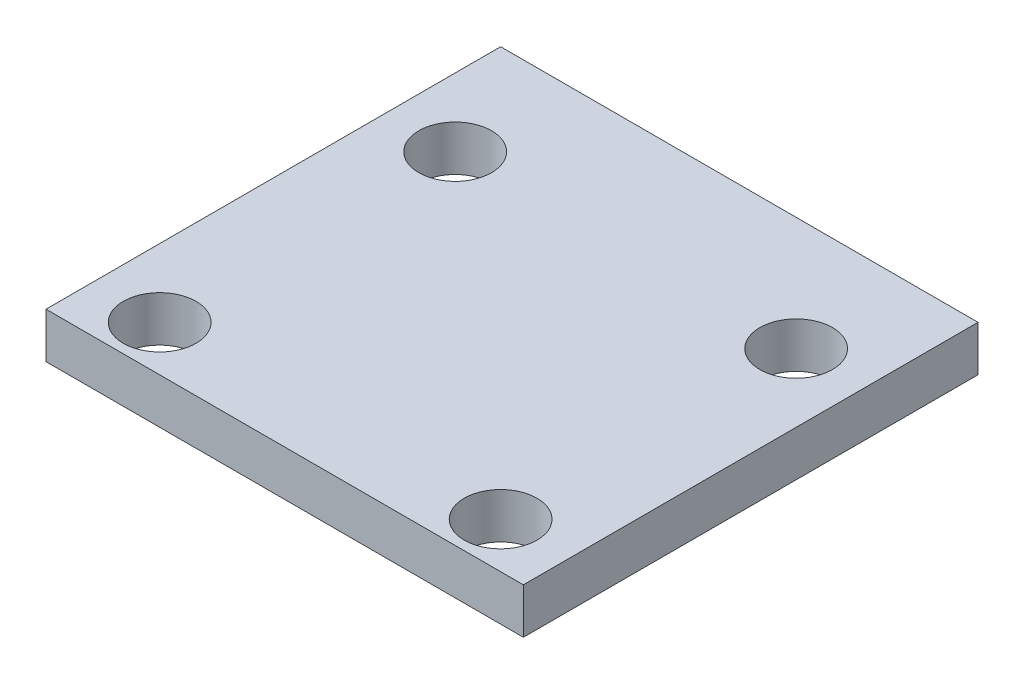
ISO-10303-21;
HEADER;
FILE_DESCRIPTION(('STEP AP214'),'2;1');
FILE_NAME('part.step','',(''),(''),'','','');
FILE_SCHEMA(('AUTOMOTIVE_DESIGN { 1 0 10303 214 1 1 1 1 }'));
ENDSEC;
DATA;
#1=APPLICATION_CONTEXT('core data for automotive mechanical design processes');
#2=APPLICATION_PROTOCOL_DEFINITION('international standard','automotive_design',2000,#1);
#3=PRODUCT_CONTEXT('',#1,'mechanical');
#4=PRODUCT('Part','Part','',(#3));
#5=PRODUCT_RELATED_PRODUCT_CATEGORY('part','',(#4));
#6=PRODUCT_DEFINITION_FORMATION('','',#4);
#7=PRODUCT_DEFINITION_CONTEXT('part definition',#1,'design');
#8=PRODUCT_DEFINITION('design','',#6,#7);
#9=PRODUCT_DEFINITION_SHAPE('','',#8);
#10=(LENGTH_UNIT() NAMED_UNIT(*) SI_UNIT(.MILLI.,.METRE.));
#11=(NAMED_UNIT(*) PLANE_ANGLE_UNIT() SI_UNIT($,.RADIAN.));
#12=(NAMED_UNIT(*) SI_UNIT($,.STERADIAN.) SOLID_ANGLE_UNIT());
#13=UNCERTAINTY_MEASURE_WITH_UNIT(LENGTH_MEASURE(1.E-05),#10,'distance_accuracy_value','');
#14=(GEOMETRIC_REPRESENTATION_CONTEXT(3) GLOBAL_UNCERTAINTY_ASSIGNED_CONTEXT((#13)) GLOBAL_UNIT_ASSIGNED_CONTEXT((#10,
#11,#12)) REPRESENTATION_CONTEXT('',''));
#15=CARTESIAN_POINT('',(0.,0.,0.));
#16=DIRECTION('',(0.,0.,1.));
#17=DIRECTION('',(1.,0.,0.));
#18=AXIS2_PLACEMENT_3D('',#15,#16,#17);
#19=CARTESIAN_POINT('',(10.5,2.,-10.));
#20=DIRECTION('',(-1.,0.,0.));
#21=DIRECTION('',(0.,0.,1.));
#22=AXIS2_PLACEMENT_3D('',#19,#20,#21);
#23=PLANE('',#22);
#24=DIRECTION('',(0.,0.,-1.));
#25=VECTOR('',#24,1.);
#26=CARTESIAN_POINT('',(10.5,0.,-10.));
#27=LINE('',#26,#25);
#28=CARTESIAN_POINT('',(10.5,0.,10.));
#29=VERTEX_POINT('',#28);
#30=CARTESIAN_POINT('',(10.5,0.,-10.));
#31=VERTEX_POINT('',#30);
#32=EDGE_CURVE('E101',#29,#31,#27,.T.);
#33=ORIENTED_EDGE('',*,*,#32,.T.);
#34=DIRECTION('',(0.,-1.,0.));
#35=VECTOR('',#34,1.);
#36=CARTESIAN_POINT('',(10.5,2.,-10.));
#37=LINE('',#36,#35);
#38=CARTESIAN_POINT('',(10.5,2.,-10.));
#39=VERTEX_POINT('',#38);
#40=EDGE_CURVE('E11',#39,#31,#37,.T.);
#41=ORIENTED_EDGE('',*,*,#40,.F.);
#42=DIRECTION('',(0.,0.,-1.));
#43=VECTOR('',#42,1.);
#44=CARTESIAN_POINT('',(10.5,2.,-10.));
#45=LINE('',#44,#43);
#46=CARTESIAN_POINT('',(10.5,2.,10.));
#47=VERTEX_POINT('',#46);
#48=EDGE_CURVE('E90',#47,#39,#45,.T.);
#49=ORIENTED_EDGE('',*,*,#48,.F.);
#50=DIRECTION('',(0.,-1.,0.));
#51=VECTOR('',#50,1.);
#52=CARTESIAN_POINT('',(10.5,2.,10.));
#53=LINE('',#52,#51);
#54=EDGE_CURVE('E100',#47,#29,#53,.T.);
#55=ORIENTED_EDGE('',*,*,#54,.T.);
#56=EDGE_LOOP('',(#33,#41,#49,#55));
#57=FACE_BOUND('',#56,.T.);
#58=ADVANCED_FACE('F36',(#57),#23,.F.);
#59=CARTESIAN_POINT('',(-10.5,2.,-10.));
#60=DIRECTION('',(0.,0.,1.));
#61=DIRECTION('',(1.,0.,0.));
#62=AXIS2_PLACEMENT_3D('',#59,#60,#61);
#63=PLANE('',#62);
#64=DIRECTION('',(-1.,0.,0.));
#65=VECTOR('',#64,1.);
#66=CARTESIAN_POINT('',(-10.5,0.,-10.));
#67=LINE('',#66,#65);
#68=CARTESIAN_POINT('',(-10.5,0.,-10.));
#69=VERTEX_POINT('',#68);
#70=EDGE_CURVE('E91',#31,#69,#67,.T.);
#71=ORIENTED_EDGE('',*,*,#70,.T.);
#72=DIRECTION('',(0.,-1.,0.));
#73=VECTOR('',#72,1.);
#74=CARTESIAN_POINT('',(-10.5,2.,-10.));
#75=LINE('',#74,#73);
#76=CARTESIAN_POINT('',(-10.5,2.,-10.));
#77=VERTEX_POINT('',#76);
#78=EDGE_CURVE('E46',#77,#69,#75,.T.);
#79=ORIENTED_EDGE('',*,*,#78,.F.);
#80=DIRECTION('',(-1.,0.,0.));
#81=VECTOR('',#80,1.);
#82=CARTESIAN_POINT('',(-10.5,2.,-10.));
#83=LINE('',#82,#81);
#84=EDGE_CURVE('E83',#39,#77,#83,.T.);
#85=ORIENTED_EDGE('',*,*,#84,.F.);
#86=ORIENTED_EDGE('',*,*,#40,.T.);
#87=EDGE_LOOP('',(#71,#79,#85,#86));
#88=FACE_BOUND('',#87,.T.);
#89=ADVANCED_FACE('F95',(#88),#63,.F.);
#90=CARTESIAN_POINT('',(-10.5,2.,-10.));
#91=DIRECTION('',(1.,0.,0.));
#92=DIRECTION('',(0.,0.,-1.));
#93=AXIS2_PLACEMENT_3D('',#90,#91,#92);
#94=PLANE('',#93);
#95=DIRECTION('',(0.,0.,1.));
#96=VECTOR('',#95,1.);
#97=CARTESIAN_POINT('',(-10.5,0.,-10.));
#98=LINE('',#97,#96);
#99=CARTESIAN_POINT('',(-10.5,0.,10.));
#100=VERTEX_POINT('',#99);
#101=EDGE_CURVE('E72',#69,#100,#98,.T.);
#102=ORIENTED_EDGE('',*,*,#101,.T.);
#103=DIRECTION('',(0.,-1.,0.));
#104=VECTOR('',#103,1.);
#105=CARTESIAN_POINT('',(-10.5,2.,10.));
#106=LINE('',#105,#104);
#107=CARTESIAN_POINT('',(-10.5,2.,10.));
#108=VERTEX_POINT('',#107);
#109=EDGE_CURVE('E94',#108,#100,#106,.T.);
#110=ORIENTED_EDGE('',*,*,#109,.F.);
#111=DIRECTION('',(0.,0.,1.));
#112=VECTOR('',#111,1.);
#113=CARTESIAN_POINT('',(-10.5,2.,-10.));
#114=LINE('',#113,#112);
#115=EDGE_CURVE('E87',#77,#108,#114,.T.);
#116=ORIENTED_EDGE('',*,*,#115,.F.);
#117=ORIENTED_EDGE('',*,*,#78,.T.);
#118=EDGE_LOOP('',(#102,#110,#116,#117));
#119=FACE_BOUND('',#118,.T.);
#120=ADVANCED_FACE('F92',(#119),#94,.F.);
#121=CARTESIAN_POINT('',(-10.5,2.,10.));
#122=DIRECTION('',(0.,0.,-1.));
#123=DIRECTION('',(-1.,0.,0.));
#124=AXIS2_PLACEMENT_3D('',#121,#122,#123);
#125=PLANE('',#124);
#126=DIRECTION('',(1.,0.,0.));
#127=VECTOR('',#126,1.);
#128=CARTESIAN_POINT('',(-10.5,0.,10.));
#129=LINE('',#128,#127);
#130=EDGE_CURVE('E79',#100,#29,#129,.T.);
#131=ORIENTED_EDGE('',*,*,#130,.T.);
#132=ORIENTED_EDGE('',*,*,#54,.F.);
#133=DIRECTION('',(1.,0.,0.));
#134=VECTOR('',#133,1.);
#135=CARTESIAN_POINT('',(-10.5,2.,10.));
#136=LINE('',#135,#134);
#137=EDGE_CURVE('E53',#108,#47,#136,.T.);
#138=ORIENTED_EDGE('',*,*,#137,.F.);
#139=ORIENTED_EDGE('',*,*,#109,.T.);
#140=EDGE_LOOP('',(#131,#132,#138,#139));
#141=FACE_BOUND('',#140,.T.);
#142=ADVANCED_FACE('F108',(#141),#125,.F.);
#143=CARTESIAN_POINT('',(0.,2.,0.));
#144=DIRECTION('',(0.,1.,0.));
#145=DIRECTION('',(0.,0.,1.));
#146=AXIS2_PLACEMENT_3D('',#143,#144,#145);
#147=PLANE('',#146);
#148=CARTESIAN_POINT('',(7.5,2.,-5.));
#149=DIRECTION('',(0.,1.,0.));
#150=DIRECTION('',(0.,0.,-1.));
#151=AXIS2_PLACEMENT_3D('',#148,#149,#150);
#152=CIRCLE('',#151,1.6);
#153=CARTESIAN_POINT('',(7.5,2.,-6.6));
#154=VERTEX_POINT('',#153);
#155=EDGE_CURVE('E123',#154,#154,#152,.T.);
#156=ORIENTED_EDGE('',*,*,#155,.F.);
#157=EDGE_LOOP('',(#156));
#158=FACE_BOUND('',#157,.T.);
#159=CARTESIAN_POINT('',(7.49999999999999,2.,8.));
#160=DIRECTION('',(0.,1.,0.));
#161=DIRECTION('',(0.,0.,-1.));
#162=AXIS2_PLACEMENT_3D('',#159,#160,#161);
#163=CIRCLE('',#162,1.6);
#164=CARTESIAN_POINT('',(7.49999999999999,2.,6.4));
#165=VERTEX_POINT('',#164);
#166=EDGE_CURVE('E130',#165,#165,#163,.T.);
#167=ORIENTED_EDGE('',*,*,#166,.F.);
#168=EDGE_LOOP('',(#167));
#169=FACE_BOUND('',#168,.T.);
#170=CARTESIAN_POINT('',(-7.5,2.,8.));
#171=DIRECTION('',(0.,1.,0.));
#172=DIRECTION('',(0.,0.,1.));
#173=AXIS2_PLACEMENT_3D('',#170,#171,#172);
#174=CIRCLE('',#173,1.6);
#175=CARTESIAN_POINT('',(-7.5,2.,9.6));
#176=VERTEX_POINT('',#175);
#177=EDGE_CURVE('E132',#176,#176,#174,.T.);
#178=ORIENTED_EDGE('',*,*,#177,.F.);
#179=EDGE_LOOP('',(#178));
#180=FACE_BOUND('',#179,.T.);
#181=CARTESIAN_POINT('',(-7.5,2.,-5.));
#182=DIRECTION('',(0.,1.,0.));
#183=DIRECTION('',(0.,0.,1.));
#184=AXIS2_PLACEMENT_3D('',#181,#182,#183);
#185=CIRCLE('',#184,1.6);
#186=CARTESIAN_POINT('',(-7.5,2.,-3.4));
#187=VERTEX_POINT('',#186);
#188=EDGE_CURVE('E113',#187,#187,#185,.T.);
#189=ORIENTED_EDGE('',*,*,#188,.F.);
#190=EDGE_LOOP('',(#189));
#191=FACE_BOUND('',#190,.T.);
#192=ORIENTED_EDGE('',*,*,#48,.T.);
#193=ORIENTED_EDGE('',*,*,#84,.T.);
#194=ORIENTED_EDGE('',*,*,#115,.T.);
#195=ORIENTED_EDGE('',*,*,#137,.T.);
#196=EDGE_LOOP('',(#192,#193,#194,#195));
#197=FACE_BOUND('',#196,.T.);
#198=ADVANCED_FACE('F85',(#158,#169,#180,#191,#197),#147,.T.);
#199=CARTESIAN_POINT('',(0.,0.,0.));
#200=DIRECTION('',(0.,1.,0.));
#201=DIRECTION('',(0.,0.,1.));
#202=AXIS2_PLACEMENT_3D('',#199,#200,#201);
#203=PLANE('',#202);
#204=CARTESIAN_POINT('',(7.5,0.,-5.));
#205=DIRECTION('',(0.,1.,0.));
#206=DIRECTION('',(0.,0.,-1.));
#207=AXIS2_PLACEMENT_3D('',#204,#205,#206);
#208=CIRCLE('',#207,1.6);
#209=CARTESIAN_POINT('',(7.5,0.,-6.6));
#210=VERTEX_POINT('',#209);
#211=EDGE_CURVE('E124',#210,#210,#208,.T.);
#212=ORIENTED_EDGE('',*,*,#211,.T.);
#213=EDGE_LOOP('',(#212));
#214=FACE_BOUND('',#213,.T.);
#215=CARTESIAN_POINT('',(7.49999999999999,0.,8.));
#216=DIRECTION('',(0.,1.,0.));
#217=DIRECTION('',(0.,0.,-1.));
#218=AXIS2_PLACEMENT_3D('',#215,#216,#217);
#219=CIRCLE('',#218,1.6);
#220=CARTESIAN_POINT('',(7.49999999999999,0.,6.4));
#221=VERTEX_POINT('',#220);
#222=EDGE_CURVE('E128',#221,#221,#219,.T.);
#223=ORIENTED_EDGE('',*,*,#222,.T.);
#224=EDGE_LOOP('',(#223));
#225=FACE_BOUND('',#224,.T.);
#226=CARTESIAN_POINT('',(-7.5,0.,8.));
#227=DIRECTION('',(0.,1.,0.));
#228=DIRECTION('',(0.,0.,1.));
#229=AXIS2_PLACEMENT_3D('',#226,#227,#228);
#230=CIRCLE('',#229,1.6);
#231=CARTESIAN_POINT('',(-7.5,0.,9.6));
#232=VERTEX_POINT('',#231);
#233=EDGE_CURVE('E117',#232,#232,#230,.T.);
#234=ORIENTED_EDGE('',*,*,#233,.T.);
#235=EDGE_LOOP('',(#234));
#236=FACE_BOUND('',#235,.T.);
#237=CARTESIAN_POINT('',(-7.5,0.,-5.));
#238=DIRECTION('',(0.,1.,0.));
#239=DIRECTION('',(0.,0.,1.));
#240=AXIS2_PLACEMENT_3D('',#237,#238,#239);
#241=CIRCLE('',#240,1.6);
#242=CARTESIAN_POINT('',(-7.5,0.,-3.4));
#243=VERTEX_POINT('',#242);
#244=EDGE_CURVE('E102',#243,#243,#241,.T.);
#245=ORIENTED_EDGE('',*,*,#244,.T.);
#246=EDGE_LOOP('',(#245));
#247=FACE_BOUND('',#246,.T.);
#248=ORIENTED_EDGE('',*,*,#32,.F.);
#249=ORIENTED_EDGE('',*,*,#130,.F.);
#250=ORIENTED_EDGE('',*,*,#101,.F.);
#251=ORIENTED_EDGE('',*,*,#70,.F.);
#252=EDGE_LOOP('',(#248,#249,#250,#251));
#253=FACE_BOUND('',#252,.T.);
#254=ADVANCED_FACE('F115',(#214,#225,#236,#247,#253),#203,.F.);
#255=CARTESIAN_POINT('',(-7.5,0.,-5.));
#256=DIRECTION('',(0.,1.,0.));
#257=DIRECTION('',(0.,0.,1.));
#258=AXIS2_PLACEMENT_3D('',#255,#256,#257);
#259=CYLINDRICAL_SURFACE('',#258,1.6);
#260=ORIENTED_EDGE('',*,*,#244,.F.);
#261=EDGE_LOOP('',(#260));
#262=FACE_BOUND('',#261,.T.);
#263=ORIENTED_EDGE('',*,*,#188,.T.);
#264=EDGE_LOOP('',(#263));
#265=FACE_BOUND('',#264,.T.);
#266=ADVANCED_FACE('F144',(#262,#265),#259,.F.);
#267=CARTESIAN_POINT('',(-7.5,0.,8.));
#268=DIRECTION('',(0.,1.,0.));
#269=DIRECTION('',(0.,0.,1.));
#270=AXIS2_PLACEMENT_3D('',#267,#268,#269);
#271=CYLINDRICAL_SURFACE('',#270,1.6);
#272=ORIENTED_EDGE('',*,*,#233,.F.);
#273=EDGE_LOOP('',(#272));
#274=FACE_BOUND('',#273,.T.);
#275=ORIENTED_EDGE('',*,*,#177,.T.);
#276=EDGE_LOOP('',(#275));
#277=FACE_BOUND('',#276,.T.);
#278=ADVANCED_FACE('F143',(#274,#277),#271,.F.);
#279=CARTESIAN_POINT('',(7.49999999999999,0.,8.));
#280=DIRECTION('',(0.,1.,0.));
#281=DIRECTION('',(0.,0.,1.));
#282=AXIS2_PLACEMENT_3D('',#279,#280,#281);
#283=CYLINDRICAL_SURFACE('',#282,1.6);
#284=ORIENTED_EDGE('',*,*,#222,.F.);
#285=EDGE_LOOP('',(#284));
#286=FACE_BOUND('',#285,.T.);
#287=ORIENTED_EDGE('',*,*,#166,.T.);
#288=EDGE_LOOP('',(#287));
#289=FACE_BOUND('',#288,.T.);
#290=ADVANCED_FACE('F145',(#286,#289),#283,.F.);
#291=CARTESIAN_POINT('',(7.5,0.,-5.));
#292=DIRECTION('',(0.,1.,0.));
#293=DIRECTION('',(0.,0.,1.));
#294=AXIS2_PLACEMENT_3D('',#291,#292,#293);
#295=CYLINDRICAL_SURFACE('',#294,1.6);
#296=ORIENTED_EDGE('',*,*,#211,.F.);
#297=EDGE_LOOP('',(#296));
#298=FACE_BOUND('',#297,.T.);
#299=ORIENTED_EDGE('',*,*,#155,.T.);
#300=EDGE_LOOP('',(#299));
#301=FACE_BOUND('',#300,.T.);
#302=ADVANCED_FACE('F199',(#298,#301),#295,.F.);
#303=CLOSED_SHELL('',(#58,#89,#120,#142,#198,#254,#266,#278,#290,#302));
#304=MANIFOLD_SOLID_BREP('B2',#303);
#305=ADVANCED_BREP_SHAPE_REPRESENTATION('',(#18,#304),#14);
#306=SHAPE_DEFINITION_REPRESENTATION(#9,#305);
ENDSEC;
END-ISO-10303-21;
